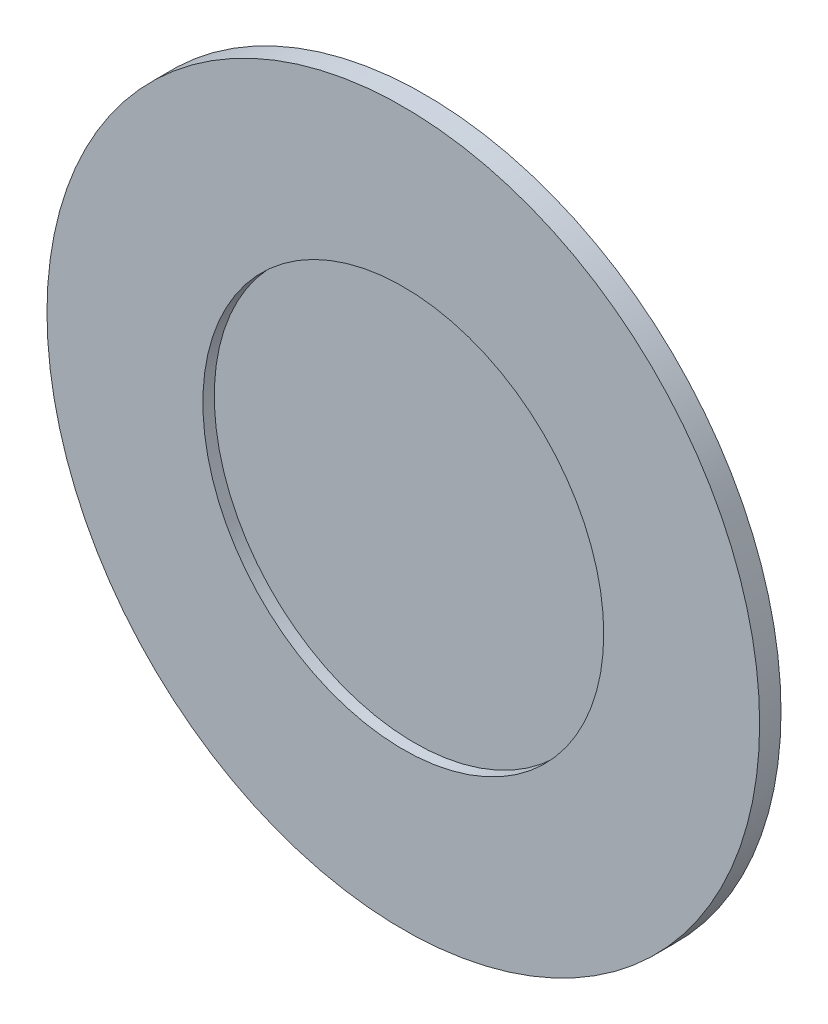
ISO-10303-21;
HEADER;
FILE_DESCRIPTION(('STEP AP214'),'2;1');
FILE_NAME('part.step','',(''),(''),'','','');
FILE_SCHEMA(('AUTOMOTIVE_DESIGN { 1 0 10303 214 1 1 1 1 }'));
ENDSEC;
DATA;
#1=APPLICATION_CONTEXT('core data for automotive mechanical design processes');
#2=APPLICATION_PROTOCOL_DEFINITION('international standard','automotive_design',2000,#1);
#3=PRODUCT_CONTEXT('',#1,'mechanical');
#4=PRODUCT('Part','Part','',(#3));
#5=PRODUCT_RELATED_PRODUCT_CATEGORY('part','',(#4));
#6=PRODUCT_DEFINITION_FORMATION('','',#4);
#7=PRODUCT_DEFINITION_CONTEXT('part definition',#1,'design');
#8=PRODUCT_DEFINITION('design','',#6,#7);
#9=PRODUCT_DEFINITION_SHAPE('','',#8);
#10=(LENGTH_UNIT() NAMED_UNIT(*) SI_UNIT(.MILLI.,.METRE.));
#11=(NAMED_UNIT(*) PLANE_ANGLE_UNIT() SI_UNIT($,.RADIAN.));
#12=(NAMED_UNIT(*) SI_UNIT($,.STERADIAN.) SOLID_ANGLE_UNIT());
#13=UNCERTAINTY_MEASURE_WITH_UNIT(LENGTH_MEASURE(1.E-05),#10,'distance_accuracy_value','');
#14=(GEOMETRIC_REPRESENTATION_CONTEXT(3) GLOBAL_UNCERTAINTY_ASSIGNED_CONTEXT((#13)) GLOBAL_UNIT_ASSIGNED_CONTEXT((#10,
#11,#12)) REPRESENTATION_CONTEXT('',''));
#15=CARTESIAN_POINT('',(0.,0.,0.));
#16=DIRECTION('',(0.,0.,1.));
#17=DIRECTION('',(1.,0.,0.));
#18=AXIS2_PLACEMENT_3D('',#15,#16,#17);
#19=CARTESIAN_POINT('',(0.,0.,0.381));
#20=DIRECTION('',(0.,0.,-1.));
#21=DIRECTION('',(-1.,0.,0.));
#22=AXIS2_PLACEMENT_3D('',#19,#20,#21);
#23=CYLINDRICAL_SURFACE('',#22,6.35);
#24=CARTESIAN_POINT('',(0.,0.,0.381));
#25=DIRECTION('',(0.,0.,1.));
#26=DIRECTION('',(1.,0.,0.));
#27=AXIS2_PLACEMENT_3D('',#24,#25,#26);
#28=CIRCLE('',#27,6.35);
#29=CARTESIAN_POINT('',(-6.35,0.,0.381));
#30=VERTEX_POINT('',#29);
#31=EDGE_CURVE('E11',#30,#30,#28,.T.);
#32=CARTESIAN_POINT('',(0.,0.,0.));
#33=DIRECTION('',(0.,0.,1.));
#34=DIRECTION('',(1.,0.,0.));
#35=AXIS2_PLACEMENT_3D('',#32,#33,#34);
#36=CIRCLE('',#35,6.35);
#37=CARTESIAN_POINT('',(-6.35,0.,0.));
#38=VERTEX_POINT('',#37);
#39=EDGE_CURVE('E38',#38,#38,#36,.T.);
#40=CARTESIAN_POINT('',(-6.35,0.,0.381));
#41=CARTESIAN_POINT('',(-6.35,0.,0.37703125));
#42=CARTESIAN_POINT('',(-6.35,0.,0.3730625));
#43=CARTESIAN_POINT('',(-6.35,0.,0.365125));
#44=CARTESIAN_POINT('',(-6.35,0.,0.36115625));
#45=CARTESIAN_POINT('',(-6.35,0.,0.35321875));
#46=CARTESIAN_POINT('',(-6.35,0.,0.34925));
#47=CARTESIAN_POINT('',(-6.35,0.,0.3413125));
#48=CARTESIAN_POINT('',(-6.35,0.,0.33734375));
#49=CARTESIAN_POINT('',(-6.35,0.,0.32940625));
#50=CARTESIAN_POINT('',(-6.35,0.,0.3254375));
#51=CARTESIAN_POINT('',(-6.35,0.,0.3175));
#52=CARTESIAN_POINT('',(-6.35,0.,0.31353125));
#53=CARTESIAN_POINT('',(-6.35,0.,0.30559375));
#54=CARTESIAN_POINT('',(-6.35,0.,0.301625));
#55=CARTESIAN_POINT('',(-6.35,0.,0.2936875));
#56=CARTESIAN_POINT('',(-6.35,0.,0.28971875));
#57=CARTESIAN_POINT('',(-6.35,0.,0.28178125));
#58=CARTESIAN_POINT('',(-6.35,0.,0.2778125));
#59=CARTESIAN_POINT('',(-6.35,0.,0.269875));
#60=CARTESIAN_POINT('',(-6.35,0.,0.26590625));
#61=CARTESIAN_POINT('',(-6.35,0.,0.25796875));
#62=CARTESIAN_POINT('',(-6.35,0.,0.254));
#63=CARTESIAN_POINT('',(-6.35,0.,0.2460625));
#64=CARTESIAN_POINT('',(-6.35,0.,0.24209375));
#65=CARTESIAN_POINT('',(-6.35,0.,0.23415625));
#66=CARTESIAN_POINT('',(-6.35,0.,0.2301875));
#67=CARTESIAN_POINT('',(-6.35,0.,0.22225));
#68=CARTESIAN_POINT('',(-6.35,0.,0.21828125));
#69=CARTESIAN_POINT('',(-6.35,0.,0.21034375));
#70=CARTESIAN_POINT('',(-6.35,0.,0.206375));
#71=CARTESIAN_POINT('',(-6.35,0.,0.1984375));
#72=CARTESIAN_POINT('',(-6.35,0.,0.19446875));
#73=CARTESIAN_POINT('',(-6.35,0.,0.18653125));
#74=CARTESIAN_POINT('',(-6.35,0.,0.1825625));
#75=CARTESIAN_POINT('',(-6.35,0.,0.174625));
#76=CARTESIAN_POINT('',(-6.35,0.,0.17065625));
#77=CARTESIAN_POINT('',(-6.35,0.,0.16271875));
#78=CARTESIAN_POINT('',(-6.35,0.,0.15875));
#79=CARTESIAN_POINT('',(-6.35,0.,0.1508125));
#80=CARTESIAN_POINT('',(-6.35,0.,0.14684375));
#81=CARTESIAN_POINT('',(-6.35,0.,0.13890625));
#82=CARTESIAN_POINT('',(-6.35,0.,0.1349375));
#83=CARTESIAN_POINT('',(-6.35,0.,0.127));
#84=CARTESIAN_POINT('',(-6.35,0.,0.12303125));
#85=CARTESIAN_POINT('',(-6.35,0.,0.11509375));
#86=CARTESIAN_POINT('',(-6.35,0.,0.111125));
#87=CARTESIAN_POINT('',(-6.35,0.,0.1031875));
#88=CARTESIAN_POINT('',(-6.35,0.,0.09921875));
#89=CARTESIAN_POINT('',(-6.35,0.,0.09128125));
#90=CARTESIAN_POINT('',(-6.35,0.,0.0873125));
#91=CARTESIAN_POINT('',(-6.35,0.,0.079375));
#92=CARTESIAN_POINT('',(-6.35,0.,0.07540625));
#93=CARTESIAN_POINT('',(-6.35,0.,0.06746875));
#94=CARTESIAN_POINT('',(-6.35,0.,0.0635));
#95=CARTESIAN_POINT('',(-6.35,0.,0.0555625));
#96=CARTESIAN_POINT('',(-6.35,0.,0.05159375));
#97=CARTESIAN_POINT('',(-6.35,0.,0.04365625));
#98=CARTESIAN_POINT('',(-6.35,0.,0.0396875));
#99=CARTESIAN_POINT('',(-6.35,0.,0.03175));
#100=CARTESIAN_POINT('',(-6.35,0.,0.02778125));
#101=CARTESIAN_POINT('',(-6.35,0.,0.01984375));
#102=CARTESIAN_POINT('',(-6.35,0.,0.015875));
#103=CARTESIAN_POINT('',(-6.35,0.,0.00793749999999999));
#104=CARTESIAN_POINT('',(-6.35,0.,0.00396874999999999));
#105=CARTESIAN_POINT('',(-6.35,0.,0.));
#106=B_SPLINE_CURVE_WITH_KNOTS('',3,(#40,#41,#42,#43,#44,#45,#46,#47,#48,#49,#50,#51,#52,#53,
#54,#55,#56,#57,#58,#59,#60,#61,#62,#63,#64,#65,#66,#67,#68,#69,#70,#71,#72,#73,#74,#75,#76,#77,
#78,#79,#80,#81,#82,#83,#84,#85,#86,#87,#88,#89,#90,#91,#92,#93,#94,#95,#96,#97,#98,#99,#100,
#101,#102,#103,#104,#105),.UNSPECIFIED.,.F.,.F.,(4,2,2,2,2,2,2,2,2,2,2,2,2,2,2,2,2,2,2,2,2,2,2,
2,2,2,2,2,2,2,2,2,4),(0.,0.01190625,0.0238125,0.03571875,0.047625,0.05953125,0.0714375,
0.08334375,0.09525,0.10715625,0.1190625,0.13096875,0.142875,0.15478125,0.1666875,0.17859375,
0.1905,0.20240625,0.2143125,0.22621875,0.238125,0.25003125,0.2619375,0.27384375,0.28575,
0.29765625,0.3095625,0.32146875,0.333375,0.34528125,0.3571875,0.36909375,0.381),.UNSPECIFIED.);
#107=EDGE_CURVE('BSEAM35',#30,#38,#106,.T.);
#108=ORIENTED_EDGE('',*,*,#31,.F.);
#109=ORIENTED_EDGE('',*,*,#39,.T.);
#110=ORIENTED_EDGE('',*,*,#107,.T.);
#111=ORIENTED_EDGE('',*,*,#107,.F.);
#112=EDGE_LOOP('',(#108,#110,#109,#111));
#113=FACE_BOUND('',#112,.T.);
#114=ADVANCED_FACE('F35',(#113),#23,.T.);
#115=CARTESIAN_POINT('',(0.,0.,0.381));
#116=DIRECTION('',(0.,0.,1.));
#117=DIRECTION('',(1.,0.,0.));
#118=AXIS2_PLACEMENT_3D('',#115,#116,#117);
#119=PLANE('',#118);
#120=CARTESIAN_POINT('',(0.,0.,0.381));
#121=DIRECTION('',(0.,0.,1.));
#122=DIRECTION('',(1.,0.,0.));
#123=AXIS2_PLACEMENT_3D('',#120,#121,#122);
#124=CIRCLE('',#123,3.571875);
#125=CARTESIAN_POINT('',(3.571875,0.,0.381));
#126=VERTEX_POINT('',#125);
#127=EDGE_CURVE('E49',#126,#126,#124,.T.);
#128=ORIENTED_EDGE('',*,*,#127,.F.);
#129=EDGE_LOOP('',(#128));
#130=FACE_BOUND('',#129,.T.);
#131=ORIENTED_EDGE('',*,*,#31,.T.);
#132=EDGE_LOOP('',(#131));
#133=FACE_BOUND('',#132,.T.);
#134=ADVANCED_FACE('F55',(#130,#133),#119,.T.);
#135=CARTESIAN_POINT('',(0.,0.,0.));
#136=DIRECTION('',(0.,0.,1.));
#137=DIRECTION('',(1.,0.,0.));
#138=AXIS2_PLACEMENT_3D('',#135,#136,#137);
#139=PLANE('',#138);
#140=ORIENTED_EDGE('',*,*,#39,.F.);
#141=EDGE_LOOP('',(#140));
#142=FACE_BOUND('',#141,.T.);
#143=ADVANCED_FACE('F57',(#142),#139,.F.);
#144=CARTESIAN_POINT('',(0.,0.,-10.1027881362028));
#145=DIRECTION('',(0.,0.,1.));
#146=DIRECTION('',(1.,0.,0.));
#147=AXIS2_PLACEMENT_3D('',#144,#145,#146);
#148=CYLINDRICAL_SURFACE('',#147,3.571875);
#149=CARTESIAN_POINT('',(0.,0.,0.177800000000001));
#150=DIRECTION('',(0.,0.,1.));
#151=DIRECTION('',(1.,0.,0.));
#152=AXIS2_PLACEMENT_3D('',#149,#150,#151);
#153=CIRCLE('',#152,3.571875);
#154=CARTESIAN_POINT('',(3.571875,0.,0.177800000000001));
#155=VERTEX_POINT('',#154);
#156=EDGE_CURVE('E45',#155,#155,#153,.F.);
#157=ORIENTED_EDGE('',*,*,#156,.T.);
#158=EDGE_LOOP('',(#157));
#159=FACE_BOUND('',#158,.T.);
#160=ORIENTED_EDGE('',*,*,#127,.T.);
#161=EDGE_LOOP('',(#160));
#162=FACE_BOUND('',#161,.T.);
#163=ADVANCED_FACE('F53',(#159,#162),#148,.F.);
#164=CARTESIAN_POINT('',(0.,0.,0.1778));
#165=DIRECTION('',(0.,0.,1.));
#166=DIRECTION('',(1.,0.,0.));
#167=AXIS2_PLACEMENT_3D('',#164,#165,#166);
#168=PLANE('',#167);
#169=ORIENTED_EDGE('',*,*,#156,.F.);
#170=EDGE_LOOP('',(#169));
#171=FACE_BOUND('',#170,.T.);
#172=ADVANCED_FACE('F68',(#171),#168,.T.);
#173=CLOSED_SHELL('',(#114,#134,#143,#163,#172));
#174=MANIFOLD_SOLID_BREP('B2',#173);
#175=ADVANCED_BREP_SHAPE_REPRESENTATION('',(#18,#174),#14);
#176=SHAPE_DEFINITION_REPRESENTATION(#9,#175);
ENDSEC;
END-ISO-10303-21;
